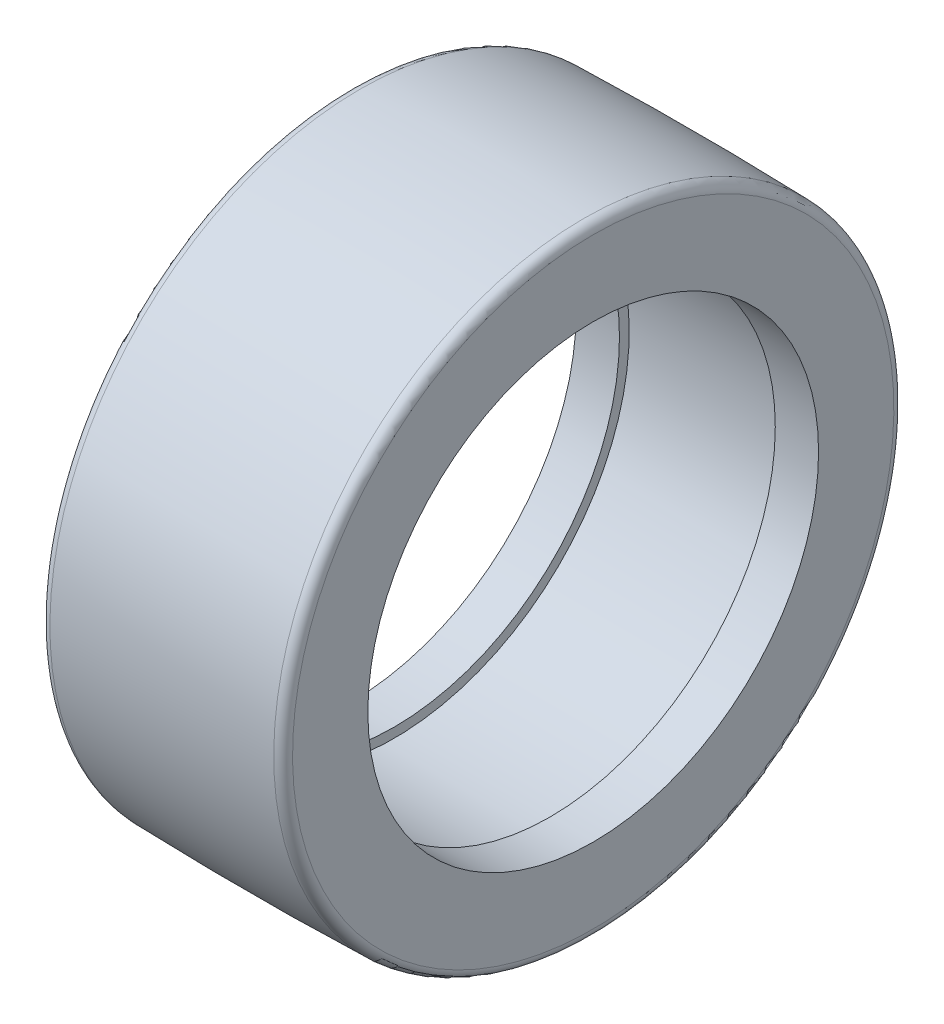
ISO-10303-21;
HEADER;
FILE_DESCRIPTION(('STEP AP214'),'2;1');
FILE_NAME('part.step','',(''),(''),'','','');
FILE_SCHEMA(('AUTOMOTIVE_DESIGN { 1 0 10303 214 1 1 1 1 }'));
ENDSEC;
DATA;
#1=APPLICATION_CONTEXT('core data for automotive mechanical design processes');
#2=APPLICATION_PROTOCOL_DEFINITION('international standard','automotive_design',2000,#1);
#3=PRODUCT_CONTEXT('',#1,'mechanical');
#4=PRODUCT('Part','Part','',(#3));
#5=PRODUCT_RELATED_PRODUCT_CATEGORY('part','',(#4));
#6=PRODUCT_DEFINITION_FORMATION('','',#4);
#7=PRODUCT_DEFINITION_CONTEXT('part definition',#1,'design');
#8=PRODUCT_DEFINITION('design','',#6,#7);
#9=PRODUCT_DEFINITION_SHAPE('','',#8);
#10=(LENGTH_UNIT() NAMED_UNIT(*) SI_UNIT(.MILLI.,.METRE.));
#11=(NAMED_UNIT(*) PLANE_ANGLE_UNIT() SI_UNIT($,.RADIAN.));
#12=(NAMED_UNIT(*) SI_UNIT($,.STERADIAN.) SOLID_ANGLE_UNIT());
#13=UNCERTAINTY_MEASURE_WITH_UNIT(LENGTH_MEASURE(1.E-05),#10,'distance_accuracy_value','');
#14=(GEOMETRIC_REPRESENTATION_CONTEXT(3) GLOBAL_UNCERTAINTY_ASSIGNED_CONTEXT((#13)) GLOBAL_UNIT_ASSIGNED_CONTEXT((#10,
#11,#12)) REPRESENTATION_CONTEXT('',''));
#15=CARTESIAN_POINT('',(0.,0.,0.));
#16=DIRECTION('',(0.,0.,1.));
#17=DIRECTION('',(1.,0.,0.));
#18=AXIS2_PLACEMENT_3D('',#15,#16,#17);
#19=CARTESIAN_POINT('',(1.1,0.,0.));
#20=DIRECTION('',(1.,0.,0.));
#21=DIRECTION('',(0.,0.,-1.));
#22=AXIS2_PLACEMENT_3D('',#19,#20,#21);
#23=TOROIDAL_SURFACE('',#22,34.7331952056129,1.1);
#24=CARTESIAN_POINT('',(0.,0.,0.));
#25=DIRECTION('',(1.,0.,0.));
#26=DIRECTION('',(0.,1.,0.));
#27=AXIS2_PLACEMENT_3D('',#24,#25,#26);
#28=CIRCLE('',#27,34.7331952056129);
#29=CARTESIAN_POINT('',(0.,34.7331952056129,0.));
#30=VERTEX_POINT('',#29);
#31=EDGE_CURVE('E11',#30,#30,#28,.T.);
#32=ORIENTED_EDGE('',*,*,#31,.T.);
#33=EDGE_LOOP('',(#32));
#34=FACE_BOUND('',#33,.T.);
#35=CARTESIAN_POINT('',(1.07155742633798,0.,0.));
#36=DIRECTION('',(1.,0.,0.));
#37=DIRECTION('',(0.,1.,0.));
#38=AXIS2_PLACEMENT_3D('',#35,#36,#37);
#39=CIRCLE('',#38,35.83282742595);
#40=CARTESIAN_POINT('',(1.07155742633798,35.83282742595,0.));
#41=VERTEX_POINT('',#40);
#42=EDGE_CURVE('E20',#41,#41,#39,.T.);
#43=ORIENTED_EDGE('',*,*,#42,.F.);
#44=EDGE_LOOP('',(#43));
#45=FACE_BOUND('',#44,.T.);
#46=ADVANCED_FACE('F17',(#34,#45),#23,.T.);
#47=CARTESIAN_POINT('',(0.,30.3840976028064,0.));
#48=DIRECTION('',(-1.,0.,0.));
#49=DIRECTION('',(0.,-1.,0.));
#50=AXIS2_PLACEMENT_3D('',#47,#48,#49);
#51=PLANE('',#50);
#52=CARTESIAN_POINT('',(0.,0.,0.));
#53=DIRECTION('',(1.,0.,0.));
#54=DIRECTION('',(0.,1.,0.));
#55=AXIS2_PLACEMENT_3D('',#52,#53,#54);
#56=CIRCLE('',#55,26.035);
#57=CARTESIAN_POINT('',(0.,26.035,0.));
#58=VERTEX_POINT('',#57);
#59=EDGE_CURVE('E25',#58,#58,#56,.T.);
#60=ORIENTED_EDGE('',*,*,#59,.T.);
#61=EDGE_LOOP('',(#60));
#62=FACE_BOUND('',#61,.T.);
#63=ORIENTED_EDGE('',*,*,#31,.F.);
#64=EDGE_LOOP('',(#63));
#65=FACE_BOUND('',#64,.T.);
#66=ADVANCED_FACE('F88',(#62,#65),#51,.T.);
#67=CARTESIAN_POINT('',(2.5,0.,0.));
#68=DIRECTION('',(-1.,0.,0.));
#69=DIRECTION('',(0.,1.,0.));
#70=AXIS2_PLACEMENT_3D('',#67,#68,#69);
#71=CYLINDRICAL_SURFACE('',#70,26.035);
#72=CARTESIAN_POINT('',(5.,0.,0.));
#73=DIRECTION('',(1.,0.,0.));
#74=DIRECTION('',(0.,1.,0.));
#75=AXIS2_PLACEMENT_3D('',#72,#73,#74);
#76=CIRCLE('',#75,26.035);
#77=CARTESIAN_POINT('',(5.,26.035,0.));
#78=VERTEX_POINT('',#77);
#79=EDGE_CURVE('E63',#78,#78,#76,.T.);
#80=ORIENTED_EDGE('',*,*,#79,.T.);
#81=EDGE_LOOP('',(#80));
#82=FACE_BOUND('',#81,.T.);
#83=ORIENTED_EDGE('',*,*,#59,.F.);
#84=EDGE_LOOP('',(#83));
#85=FACE_BOUND('',#84,.T.);
#86=ADVANCED_FACE('F93',(#82,#85),#71,.F.);
#87=CARTESIAN_POINT('',(5.,26.5975,0.));
#88=DIRECTION('',(1.,0.,0.));
#89=DIRECTION('',(0.,1.,0.));
#90=AXIS2_PLACEMENT_3D('',#87,#88,#89);
#91=PLANE('',#90);
#92=CARTESIAN_POINT('',(5.,0.,0.));
#93=DIRECTION('',(1.,0.,0.));
#94=DIRECTION('',(0.,1.,0.));
#95=AXIS2_PLACEMENT_3D('',#92,#93,#94);
#96=CIRCLE('',#95,27.16);
#97=CARTESIAN_POINT('',(5.,27.16,0.));
#98=VERTEX_POINT('',#97);
#99=EDGE_CURVE('E59',#98,#98,#96,.T.);
#100=ORIENTED_EDGE('',*,*,#99,.T.);
#101=EDGE_LOOP('',(#100));
#102=FACE_BOUND('',#101,.T.);
#103=ORIENTED_EDGE('',*,*,#79,.F.);
#104=EDGE_LOOP('',(#103));
#105=FACE_BOUND('',#104,.T.);
#106=ADVANCED_FACE('F60',(#102,#105),#91,.T.);
#107=CARTESIAN_POINT('',(14.,0.,0.));
#108=DIRECTION('',(-1.,0.,0.));
#109=DIRECTION('',(0.,1.,0.));
#110=AXIS2_PLACEMENT_3D('',#107,#108,#109);
#111=CYLINDRICAL_SURFACE('',#110,27.16);
#112=CARTESIAN_POINT('',(23.,0.,0.));
#113=DIRECTION('',(1.,0.,0.));
#114=DIRECTION('',(0.,1.,0.));
#115=AXIS2_PLACEMENT_3D('',#112,#113,#114);
#116=CIRCLE('',#115,27.16);
#117=CARTESIAN_POINT('',(23.,27.16,0.));
#118=VERTEX_POINT('',#117);
#119=EDGE_CURVE('E64',#118,#118,#116,.T.);
#120=ORIENTED_EDGE('',*,*,#119,.T.);
#121=EDGE_LOOP('',(#120));
#122=FACE_BOUND('',#121,.T.);
#123=ORIENTED_EDGE('',*,*,#99,.F.);
#124=EDGE_LOOP('',(#123));
#125=FACE_BOUND('',#124,.T.);
#126=ADVANCED_FACE('F112',(#122,#125),#111,.F.);
#127=CARTESIAN_POINT('',(23.,26.5975,0.));
#128=DIRECTION('',(-1.,0.,0.));
#129=DIRECTION('',(0.,-1.,0.));
#130=AXIS2_PLACEMENT_3D('',#127,#128,#129);
#131=PLANE('',#130);
#132=CARTESIAN_POINT('',(23.,0.,0.));
#133=DIRECTION('',(1.,0.,0.));
#134=DIRECTION('',(0.,1.,0.));
#135=AXIS2_PLACEMENT_3D('',#132,#133,#134);
#136=CIRCLE('',#135,26.035);
#137=CARTESIAN_POINT('',(23.,26.035,0.));
#138=VERTEX_POINT('',#137);
#139=EDGE_CURVE('E67',#138,#138,#136,.T.);
#140=ORIENTED_EDGE('',*,*,#139,.T.);
#141=EDGE_LOOP('',(#140));
#142=FACE_BOUND('',#141,.T.);
#143=ORIENTED_EDGE('',*,*,#119,.F.);
#144=EDGE_LOOP('',(#143));
#145=FACE_BOUND('',#144,.T.);
#146=ADVANCED_FACE('F110',(#142,#145),#131,.T.);
#147=CARTESIAN_POINT('',(25.5,0.,0.));
#148=DIRECTION('',(-1.,0.,0.));
#149=DIRECTION('',(0.,1.,0.));
#150=AXIS2_PLACEMENT_3D('',#147,#148,#149);
#151=CYLINDRICAL_SURFACE('',#150,26.035);
#152=CARTESIAN_POINT('',(28.,0.,0.));
#153=DIRECTION('',(1.,0.,0.));
#154=DIRECTION('',(0.,1.,0.));
#155=AXIS2_PLACEMENT_3D('',#152,#153,#154);
#156=CIRCLE('',#155,26.035);
#157=CARTESIAN_POINT('',(28.,26.035,0.));
#158=VERTEX_POINT('',#157);
#159=EDGE_CURVE('E73',#158,#158,#156,.T.);
#160=ORIENTED_EDGE('',*,*,#159,.T.);
#161=EDGE_LOOP('',(#160));
#162=FACE_BOUND('',#161,.T.);
#163=ORIENTED_EDGE('',*,*,#139,.F.);
#164=EDGE_LOOP('',(#163));
#165=FACE_BOUND('',#164,.T.);
#166=ADVANCED_FACE('F108',(#162,#165),#151,.F.);
#167=CARTESIAN_POINT('',(28.,30.3840976028064,0.));
#168=DIRECTION('',(1.,0.,0.));
#169=DIRECTION('',(0.,1.,0.));
#170=AXIS2_PLACEMENT_3D('',#167,#168,#169);
#171=PLANE('',#170);
#172=CARTESIAN_POINT('',(28.,0.,0.));
#173=DIRECTION('',(1.,0.,0.));
#174=DIRECTION('',(0.,1.,0.));
#175=AXIS2_PLACEMENT_3D('',#172,#173,#174);
#176=CIRCLE('',#175,34.7331952056129);
#177=CARTESIAN_POINT('',(28.,34.7331952056129,0.));
#178=VERTEX_POINT('',#177);
#179=EDGE_CURVE('E76',#178,#178,#176,.T.);
#180=ORIENTED_EDGE('',*,*,#179,.T.);
#181=EDGE_LOOP('',(#180));
#182=FACE_BOUND('',#181,.T.);
#183=ORIENTED_EDGE('',*,*,#159,.F.);
#184=EDGE_LOOP('',(#183));
#185=FACE_BOUND('',#184,.T.);
#186=ADVANCED_FACE('F103',(#182,#185),#171,.T.);
#187=CARTESIAN_POINT('',(26.9,0.,0.));
#188=DIRECTION('',(1.,0.,0.));
#189=DIRECTION('',(0.,0.,-1.));
#190=AXIS2_PLACEMENT_3D('',#187,#188,#189);
#191=TOROIDAL_SURFACE('',#190,34.7331952056129,1.1);
#192=CARTESIAN_POINT('',(26.928442573662,0.,0.));
#193=DIRECTION('',(1.,0.,0.));
#194=DIRECTION('',(0.,1.,0.));
#195=AXIS2_PLACEMENT_3D('',#192,#193,#194);
#196=CIRCLE('',#195,35.8328274259501);
#197=CARTESIAN_POINT('',(26.928442573662,35.8328274259501,0.));
#198=VERTEX_POINT('',#197);
#199=EDGE_CURVE('E71',#198,#198,#196,.T.);
#200=ORIENTED_EDGE('',*,*,#199,.T.);
#201=EDGE_LOOP('',(#200));
#202=FACE_BOUND('',#201,.T.);
#203=ORIENTED_EDGE('',*,*,#179,.F.);
#204=EDGE_LOOP('',(#203));
#205=FACE_BOUND('',#204,.T.);
#206=ADVANCED_FACE('F107',(#202,#205),#191,.T.);
#207=CARTESIAN_POINT('',(14.,0.,0.));
#208=DIRECTION('',(1.,0.,0.));
#209=DIRECTION('',(0.,0.,1.));
#210=AXIS2_PLACEMENT_3D('',#207,#208,#209);
#211=DEGENERATE_TOROIDAL_SURFACE('',#210,464.,500.,.F.);
#212=ORIENTED_EDGE('',*,*,#42,.T.);
#213=EDGE_LOOP('',(#212));
#214=FACE_BOUND('',#213,.T.);
#215=ORIENTED_EDGE('',*,*,#199,.F.);
#216=EDGE_LOOP('',(#215));
#217=FACE_BOUND('',#216,.T.);
#218=ADVANCED_FACE('F84',(#214,#217),#211,.F.);
#219=CLOSED_SHELL('',(#46,#66,#86,#106,#126,#146,#166,#186,#206,#218));
#220=MANIFOLD_SOLID_BREP('B1',#219);
#221=ADVANCED_BREP_SHAPE_REPRESENTATION('',(#18,#220),#14);
#222=SHAPE_DEFINITION_REPRESENTATION(#9,#221);
ENDSEC;
END-ISO-10303-21;
